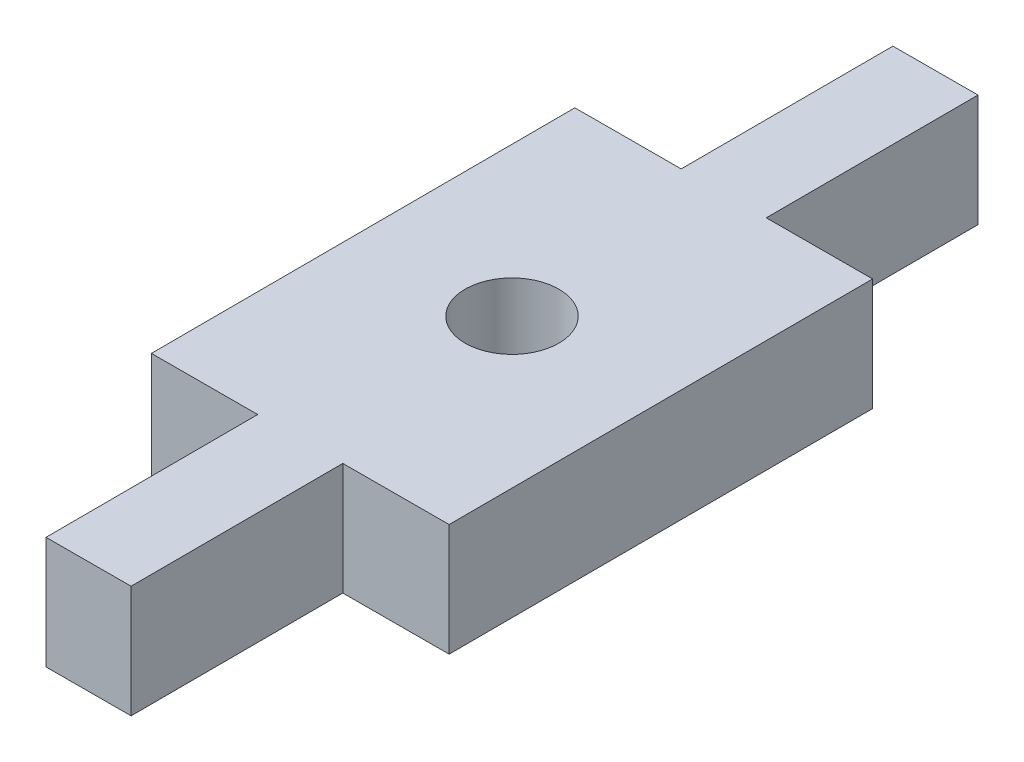
ISO-10303-21;
HEADER;
FILE_DESCRIPTION(('STEP AP214'),'2;1');
FILE_NAME('part.step','',(''),(''),'','','');
FILE_SCHEMA(('AUTOMOTIVE_DESIGN { 1 0 10303 214 1 1 1 1 }'));
ENDSEC;
DATA;
#1=APPLICATION_CONTEXT('core data for automotive mechanical design processes');
#2=APPLICATION_PROTOCOL_DEFINITION('international standard','automotive_design',2000,#1);
#3=PRODUCT_CONTEXT('',#1,'mechanical');
#4=PRODUCT('Part','Part','',(#3));
#5=PRODUCT_RELATED_PRODUCT_CATEGORY('part','',(#4));
#6=PRODUCT_DEFINITION_FORMATION('','',#4);
#7=PRODUCT_DEFINITION_CONTEXT('part definition',#1,'design');
#8=PRODUCT_DEFINITION('design','',#6,#7);
#9=PRODUCT_DEFINITION_SHAPE('','',#8);
#10=(LENGTH_UNIT() NAMED_UNIT(*) SI_UNIT(.MILLI.,.METRE.));
#11=(NAMED_UNIT(*) PLANE_ANGLE_UNIT() SI_UNIT($,.RADIAN.));
#12=(NAMED_UNIT(*) SI_UNIT($,.STERADIAN.) SOLID_ANGLE_UNIT());
#13=UNCERTAINTY_MEASURE_WITH_UNIT(LENGTH_MEASURE(1.E-05),#10,'distance_accuracy_value','');
#14=(GEOMETRIC_REPRESENTATION_CONTEXT(3) GLOBAL_UNCERTAINTY_ASSIGNED_CONTEXT((#13)) GLOBAL_UNIT_ASSIGNED_CONTEXT((#10,
#11,#12)) REPRESENTATION_CONTEXT('',''));
#15=CARTESIAN_POINT('',(0.,0.,0.));
#16=DIRECTION('',(0.,0.,1.));
#17=DIRECTION('',(1.,0.,0.));
#18=AXIS2_PLACEMENT_3D('',#15,#16,#17);
#19=CARTESIAN_POINT('',(0.,3.175,0.));
#20=DIRECTION('',(0.,1.,0.));
#21=DIRECTION('',(0.,0.,1.));
#22=AXIS2_PLACEMENT_3D('',#19,#20,#21);
#23=PLANE('',#22);
#24=DIRECTION('',(0.999997580008784,0.,-0.00219999467602244));
#25=VECTOR('',#24,1.);
#26=CARTESIAN_POINT('',(92.4276741866698,3.175,-114.600216956215));
#27=LINE('',#26,#25);
#28=CARTESIAN_POINT('',(92.4276741866698,3.175,-114.600216956215));
#29=VERTEX_POINT('',#28);
#30=CARTESIAN_POINT('',(95.4276741866698,3.175,-114.606816956215));
#31=VERTEX_POINT('',#30);
#32=EDGE_CURVE('E179',#29,#31,#27,.T.);
#33=ORIENTED_EDGE('',*,*,#32,.T.);
#34=DIRECTION('',(0.00228106838266912,0.,0.999997398360132));
#35=VECTOR('',#34,1.);
#36=CARTESIAN_POINT('',(95.4276741866698,3.175,-114.606816956215));
#37=LINE('',#36,#35);
#38=CARTESIAN_POINT('',(95.4413604477624,3.175,-108.606897975344));
#39=VERTEX_POINT('',#38);
#40=EDGE_CURVE('E107',#31,#39,#37,.T.);
#41=ORIENTED_EDGE('',*,*,#40,.T.);
#42=DIRECTION('',(0.999997468759611,0.,-0.002249994304716));
#43=VECTOR('',#42,1.);
#44=CARTESIAN_POINT('',(95.4413604477624,3.175,-108.606897975344));
#45=LINE('',#44,#43);
#46=CARTESIAN_POINT('',(97.8413604477624,3.175,-108.612297975344));
#47=VERTEX_POINT('',#46);
#48=EDGE_CURVE('E206',#39,#47,#45,.T.);
#49=ORIENTED_EDGE('',*,*,#48,.T.);
#50=DIRECTION('',(-0.00226666084387663,0.,-0.99999743112101));
#51=VECTOR('',#50,1.);
#52=CARTESIAN_POINT('',(97.8413604477624,3.175,-108.612297975344));
#53=LINE('',#52,#51);
#54=CARTESIAN_POINT('',(97.8277606867294,3.175,-114.612192548722));
#55=VERTEX_POINT('',#54);
#56=EDGE_CURVE('E225',#47,#55,#53,.T.);
#57=ORIENTED_EDGE('',*,*,#56,.T.);
#58=DIRECTION('',(0.999997412326608,0.,-0.00227493738100782));
#59=VECTOR('',#58,1.);
#60=CARTESIAN_POINT('',(97.8277606867294,3.175,-114.612192548722));
#61=LINE('',#60,#59);
#62=CARTESIAN_POINT('',(100.827653148747,3.175,-114.619017133883));
#63=VERTEX_POINT('',#62);
#64=EDGE_CURVE('E222',#55,#63,#61,.T.);
#65=ORIENTED_EDGE('',*,*,#64,.T.);
#66=DIRECTION('',(-0.00225003180504995,0.,-0.999997468675234));
#67=VECTOR('',#66,1.);
#68=CARTESIAN_POINT('',(100.827653148747,3.175,-114.619017133883));
#69=LINE('',#68,#67);
#70=CARTESIAN_POINT('',(100.800652767078,3.175,-126.618986761707));
#71=VERTEX_POINT('',#70);
#72=EDGE_CURVE('E224',#63,#71,#69,.T.);
#73=ORIENTED_EDGE('',*,*,#72,.T.);
#74=DIRECTION('',(-0.999997412326608,0.,0.00227493738100863));
#75=VECTOR('',#74,1.);
#76=CARTESIAN_POINT('',(100.800652767078,3.175,-126.618986761707));
#77=LINE('',#76,#75);
#78=CARTESIAN_POINT('',(97.8007607520716,3.175,-126.612162177564));
#79=VERTEX_POINT('',#78);
#80=EDGE_CURVE('E227',#71,#79,#77,.T.);
#81=ORIENTED_EDGE('',*,*,#80,.T.);
#82=DIRECTION('',(-0.00223332776366746,0.,-0.99999750612044));
#83=VECTOR('',#82,1.);
#84=CARTESIAN_POINT('',(97.8007607520716,3.175,-126.612162177564));
#85=LINE('',#84,#83);
#86=CARTESIAN_POINT('',(97.7873605844644,3.175,-132.612237225575));
#87=VERTEX_POINT('',#86);
#88=EDGE_CURVE('E233',#79,#87,#85,.T.);
#89=ORIENTED_EDGE('',*,*,#88,.T.);
#90=DIRECTION('',(-0.999997468759611,0.,0.002249994304716));
#91=VECTOR('',#90,1.);
#92=CARTESIAN_POINT('',(97.7873605844644,3.175,-132.612237225575));
#93=LINE('',#92,#91);
#94=CARTESIAN_POINT('',(95.3873605844644,3.175,-132.606837225575));
#95=VERTEX_POINT('',#94);
#96=EDGE_CURVE('E138',#87,#95,#93,.T.);
#97=ORIENTED_EDGE('',*,*,#96,.T.);
#98=DIRECTION('',(0.00223558704985642,0.,0.999997501072149));
#99=VECTOR('',#98,1.);
#100=CARTESIAN_POINT('',(95.3873605844644,3.175,-132.606837225575));
#101=LINE('',#100,#99);
#102=CARTESIAN_POINT('',(95.4007742529776,3.175,-126.606786816326));
#103=VERTEX_POINT('',#102);
#104=EDGE_CURVE('E132',#95,#103,#101,.T.);
#105=ORIENTED_EDGE('',*,*,#104,.T.);
#106=DIRECTION('',(-0.999997580008784,0.,0.00219999467602248));
#107=VECTOR('',#106,1.);
#108=CARTESIAN_POINT('',(95.4007742529776,3.175,-126.606786816326));
#109=LINE('',#108,#107);
#110=CARTESIAN_POINT('',(92.4006738049754,3.175,-126.60018659534));
#111=VERTEX_POINT('',#110);
#112=EDGE_CURVE('E136',#103,#111,#109,.T.);
#113=ORIENTED_EDGE('',*,*,#112,.T.);
#114=DIRECTION('',(0.00225003180504973,0.,0.999997468675234));
#115=VECTOR('',#114,1.);
#116=CARTESIAN_POINT('',(92.4006738049754,3.175,-126.60018659534));
#117=LINE('',#116,#115);
#118=EDGE_CURVE('E52',#111,#29,#117,.T.);
#119=ORIENTED_EDGE('',*,*,#118,.T.);
#120=EDGE_LOOP('',(#33,#41,#49,#57,#65,#73,#81,#89,#97,#105,#113,#119));
#121=FACE_BOUND('',#120,.T.);
#122=CARTESIAN_POINT('',(96.6141635549539,3.175,-120.609567157297));
#123=DIRECTION('',(0.,1.,0.));
#124=DIRECTION('',(0.,0.,1.));
#125=AXIS2_PLACEMENT_3D('',#122,#123,#124);
#126=CIRCLE('',#125,1.32487402891747);
#127=CARTESIAN_POINT('',(96.6141635549539,3.175,-119.28469312838));
#128=VERTEX_POINT('',#127);
#129=EDGE_CURVE('E160',#128,#128,#126,.T.);
#130=ORIENTED_EDGE('',*,*,#129,.F.);
#131=EDGE_LOOP('',(#130));
#132=FACE_BOUND('',#131,.T.);
#133=ADVANCED_FACE('F35',(#121,#132),#23,.T.);
#134=CARTESIAN_POINT('',(0.,0.,0.));
#135=DIRECTION('',(0.,1.,0.));
#136=DIRECTION('',(0.,0.,1.));
#137=AXIS2_PLACEMENT_3D('',#134,#135,#136);
#138=PLANE('',#137);
#139=DIRECTION('',(0.999997580008784,0.,-0.00219999467602244));
#140=VECTOR('',#139,1.);
#141=CARTESIAN_POINT('',(92.4276741866698,0.,-114.600216956215));
#142=LINE('',#141,#140);
#143=CARTESIAN_POINT('',(92.4276741866698,0.,-114.600216956215));
#144=VERTEX_POINT('',#143);
#145=CARTESIAN_POINT('',(95.4276741866698,0.,-114.606816956215));
#146=VERTEX_POINT('',#145);
#147=EDGE_CURVE('E156',#144,#146,#142,.T.);
#148=ORIENTED_EDGE('',*,*,#147,.F.);
#149=DIRECTION('',(0.00225003180504973,0.,0.999997468675234));
#150=VECTOR('',#149,1.);
#151=CARTESIAN_POINT('',(92.4006738049754,0.,-126.60018659534));
#152=LINE('',#151,#150);
#153=CARTESIAN_POINT('',(92.4006738049754,0.,-126.60018659534));
#154=VERTEX_POINT('',#153);
#155=EDGE_CURVE('E99',#154,#144,#152,.T.);
#156=ORIENTED_EDGE('',*,*,#155,.F.);
#157=DIRECTION('',(-0.999997580008784,0.,0.00219999467602248));
#158=VECTOR('',#157,1.);
#159=CARTESIAN_POINT('',(95.4007742529776,0.,-126.606786816326));
#160=LINE('',#159,#158);
#161=CARTESIAN_POINT('',(95.4007742529776,0.,-126.606786816326));
#162=VERTEX_POINT('',#161);
#163=EDGE_CURVE('E93',#162,#154,#160,.T.);
#164=ORIENTED_EDGE('',*,*,#163,.F.);
#165=DIRECTION('',(0.00223558704985642,0.,0.999997501072149));
#166=VECTOR('',#165,1.);
#167=CARTESIAN_POINT('',(95.3873605844644,0.,-132.606837225575));
#168=LINE('',#167,#166);
#169=CARTESIAN_POINT('',(95.3873605844644,0.,-132.606837225575));
#170=VERTEX_POINT('',#169);
#171=EDGE_CURVE('E146',#170,#162,#168,.T.);
#172=ORIENTED_EDGE('',*,*,#171,.F.);
#173=DIRECTION('',(-0.999997468759611,0.,0.002249994304716));
#174=VECTOR('',#173,1.);
#175=CARTESIAN_POINT('',(97.7873605844644,0.,-132.612237225575));
#176=LINE('',#175,#174);
#177=CARTESIAN_POINT('',(97.7873605844644,0.,-132.612237225575));
#178=VERTEX_POINT('',#177);
#179=EDGE_CURVE('E174',#178,#170,#176,.T.);
#180=ORIENTED_EDGE('',*,*,#179,.F.);
#181=DIRECTION('',(-0.00223332776366746,0.,-0.99999750612044));
#182=VECTOR('',#181,1.);
#183=CARTESIAN_POINT('',(97.8007607520716,0.,-126.612162177564));
#184=LINE('',#183,#182);
#185=CARTESIAN_POINT('',(97.8007607520716,0.,-126.612162177564));
#186=VERTEX_POINT('',#185);
#187=EDGE_CURVE('E172',#186,#178,#184,.T.);
#188=ORIENTED_EDGE('',*,*,#187,.F.);
#189=DIRECTION('',(-0.999997412326608,0.,0.00227493738100863));
#190=VECTOR('',#189,1.);
#191=CARTESIAN_POINT('',(100.800652767078,0.,-126.618986761707));
#192=LINE('',#191,#190);
#193=CARTESIAN_POINT('',(100.800652767078,0.,-126.618986761707));
#194=VERTEX_POINT('',#193);
#195=EDGE_CURVE('E170',#194,#186,#192,.T.);
#196=ORIENTED_EDGE('',*,*,#195,.F.);
#197=DIRECTION('',(-0.00225003180504995,0.,-0.999997468675234));
#198=VECTOR('',#197,1.);
#199=CARTESIAN_POINT('',(100.827653148747,0.,-114.619017133883));
#200=LINE('',#199,#198);
#201=CARTESIAN_POINT('',(100.827653148747,0.,-114.619017133883));
#202=VERTEX_POINT('',#201);
#203=EDGE_CURVE('E168',#202,#194,#200,.T.);
#204=ORIENTED_EDGE('',*,*,#203,.F.);
#205=DIRECTION('',(0.999997412326608,0.,-0.00227493738100782));
#206=VECTOR('',#205,1.);
#207=CARTESIAN_POINT('',(97.8277606867294,0.,-114.612192548722));
#208=LINE('',#207,#206);
#209=CARTESIAN_POINT('',(97.8277606867294,0.,-114.612192548722));
#210=VERTEX_POINT('',#209);
#211=EDGE_CURVE('E166',#210,#202,#208,.T.);
#212=ORIENTED_EDGE('',*,*,#211,.F.);
#213=DIRECTION('',(-0.00226666084387663,0.,-0.99999743112101));
#214=VECTOR('',#213,1.);
#215=CARTESIAN_POINT('',(97.8413604477624,0.,-108.612297975344));
#216=LINE('',#215,#214);
#217=CARTESIAN_POINT('',(97.8413604477624,0.,-108.612297975344));
#218=VERTEX_POINT('',#217);
#219=EDGE_CURVE('E164',#218,#210,#216,.T.);
#220=ORIENTED_EDGE('',*,*,#219,.F.);
#221=DIRECTION('',(0.999997468759611,0.,-0.002249994304716));
#222=VECTOR('',#221,1.);
#223=CARTESIAN_POINT('',(95.4413604477624,0.,-108.606897975344));
#224=LINE('',#223,#222);
#225=CARTESIAN_POINT('',(95.4413604477624,0.,-108.606897975344));
#226=VERTEX_POINT('',#225);
#227=EDGE_CURVE('E162',#226,#218,#224,.T.);
#228=ORIENTED_EDGE('',*,*,#227,.F.);
#229=DIRECTION('',(0.00228106838266912,0.,0.999997398360132));
#230=VECTOR('',#229,1.);
#231=CARTESIAN_POINT('',(95.4276741866698,0.,-114.606816956215));
#232=LINE('',#231,#230);
#233=EDGE_CURVE('E159',#146,#226,#232,.T.);
#234=ORIENTED_EDGE('',*,*,#233,.F.);
#235=EDGE_LOOP('',(#148,#156,#164,#172,#180,#188,#196,#204,#212,#220,#228,#234));
#236=FACE_BOUND('',#235,.T.);
#237=CARTESIAN_POINT('',(96.6141635549539,0.,-120.609567157297));
#238=DIRECTION('',(0.,1.,0.));
#239=DIRECTION('',(0.,0.,1.));
#240=AXIS2_PLACEMENT_3D('',#237,#238,#239);
#241=CIRCLE('',#240,1.32487402891747);
#242=CARTESIAN_POINT('',(96.6141635549539,0.,-119.28469312838));
#243=VERTEX_POINT('',#242);
#244=EDGE_CURVE('E380',#243,#243,#241,.T.);
#245=ORIENTED_EDGE('',*,*,#244,.T.);
#246=EDGE_LOOP('',(#245));
#247=FACE_BOUND('',#246,.T.);
#248=ADVANCED_FACE('F210',(#236,#247),#138,.F.);
#249=CARTESIAN_POINT('',(92.4276741866698,3.175,-114.600216956215));
#250=DIRECTION('',(-0.00219999467602244,0.,-0.999997580008785));
#251=DIRECTION('',(-0.999997580008785,0.,0.00219999467602244));
#252=AXIS2_PLACEMENT_3D('',#249,#250,#251);
#253=PLANE('',#252);
#254=ORIENTED_EDGE('',*,*,#147,.T.);
#255=DIRECTION('',(0.,-1.,0.));
#256=VECTOR('',#255,1.);
#257=CARTESIAN_POINT('',(95.4276741866698,3.175,-114.606816956215));
#258=LINE('',#257,#256);
#259=EDGE_CURVE('E11',#31,#146,#258,.T.);
#260=ORIENTED_EDGE('',*,*,#259,.F.);
#261=ORIENTED_EDGE('',*,*,#32,.F.);
#262=DIRECTION('',(0.,-1.,0.));
#263=VECTOR('',#262,1.);
#264=CARTESIAN_POINT('',(92.4276741866698,3.175,-114.600216956215));
#265=LINE('',#264,#263);
#266=EDGE_CURVE('E152',#29,#144,#265,.T.);
#267=ORIENTED_EDGE('',*,*,#266,.T.);
#268=EDGE_LOOP('',(#254,#260,#261,#267));
#269=FACE_BOUND('',#268,.T.);
#270=ADVANCED_FACE('F37',(#269),#253,.F.);
#271=CARTESIAN_POINT('',(95.4276741866698,3.175,-114.606816956215));
#272=DIRECTION('',(0.999997398360132,0.,-0.00228106838266912));
#273=DIRECTION('',(-0.00228106838266912,0.,-0.999997398360133));
#274=AXIS2_PLACEMENT_3D('',#271,#272,#273);
#275=PLANE('',#274);
#276=ORIENTED_EDGE('',*,*,#233,.T.);
#277=DIRECTION('',(0.,-1.,0.));
#278=VECTOR('',#277,1.);
#279=CARTESIAN_POINT('',(95.4413604477624,3.175,-108.606897975344));
#280=LINE('',#279,#278);
#281=EDGE_CURVE('E44',#39,#226,#280,.T.);
#282=ORIENTED_EDGE('',*,*,#281,.F.);
#283=ORIENTED_EDGE('',*,*,#40,.F.);
#284=ORIENTED_EDGE('',*,*,#259,.T.);
#285=EDGE_LOOP('',(#276,#282,#283,#284));
#286=FACE_BOUND('',#285,.T.);
#287=ADVANCED_FACE('F267',(#286),#275,.F.);
#288=CARTESIAN_POINT('',(95.4413604477624,3.175,-108.606897975344));
#289=DIRECTION('',(-0.002249994304716,0.,-0.999997468759611));
#290=DIRECTION('',(-0.999997468759611,0.,0.002249994304716));
#291=AXIS2_PLACEMENT_3D('',#288,#289,#290);
#292=PLANE('',#291);
#293=ORIENTED_EDGE('',*,*,#227,.T.);
#294=DIRECTION('',(0.,-1.,0.));
#295=VECTOR('',#294,1.);
#296=CARTESIAN_POINT('',(97.8413604477624,3.175,-108.612297975344));
#297=LINE('',#296,#295);
#298=EDGE_CURVE('E198',#47,#218,#297,.T.);
#299=ORIENTED_EDGE('',*,*,#298,.F.);
#300=ORIENTED_EDGE('',*,*,#48,.F.);
#301=ORIENTED_EDGE('',*,*,#281,.T.);
#302=EDGE_LOOP('',(#293,#299,#300,#301));
#303=FACE_BOUND('',#302,.T.);
#304=ADVANCED_FACE('F204',(#303),#292,.F.);
#305=CARTESIAN_POINT('',(97.8413604477624,3.175,-108.612297975344));
#306=DIRECTION('',(-0.99999743112101,0.,0.00226666084387663));
#307=DIRECTION('',(0.00226666084387663,0.,0.99999743112101));
#308=AXIS2_PLACEMENT_3D('',#305,#306,#307);
#309=PLANE('',#308);
#310=ORIENTED_EDGE('',*,*,#219,.T.);
#311=DIRECTION('',(0.,-1.,0.));
#312=VECTOR('',#311,1.);
#313=CARTESIAN_POINT('',(97.8277606867294,3.175,-114.612192548722));
#314=LINE('',#313,#312);
#315=EDGE_CURVE('E195',#55,#210,#314,.T.);
#316=ORIENTED_EDGE('',*,*,#315,.F.);
#317=ORIENTED_EDGE('',*,*,#56,.F.);
#318=ORIENTED_EDGE('',*,*,#298,.T.);
#319=EDGE_LOOP('',(#310,#316,#317,#318));
#320=FACE_BOUND('',#319,.T.);
#321=ADVANCED_FACE('F216',(#320),#309,.F.);
#322=CARTESIAN_POINT('',(97.8277606867294,3.175,-114.612192548722));
#323=DIRECTION('',(-0.00227493738100782,0.,-0.999997412326608));
#324=DIRECTION('',(-0.999997412326608,0.,0.00227493738100782));
#325=AXIS2_PLACEMENT_3D('',#322,#323,#324);
#326=PLANE('',#325);
#327=ORIENTED_EDGE('',*,*,#211,.T.);
#328=DIRECTION('',(0.,-1.,0.));
#329=VECTOR('',#328,1.);
#330=CARTESIAN_POINT('',(100.827653148747,3.175,-114.619017133883));
#331=LINE('',#330,#329);
#332=EDGE_CURVE('E192',#63,#202,#331,.T.);
#333=ORIENTED_EDGE('',*,*,#332,.F.);
#334=ORIENTED_EDGE('',*,*,#64,.F.);
#335=ORIENTED_EDGE('',*,*,#315,.T.);
#336=EDGE_LOOP('',(#327,#333,#334,#335));
#337=FACE_BOUND('',#336,.T.);
#338=ADVANCED_FACE('F220',(#337),#326,.F.);
#339=CARTESIAN_POINT('',(100.827653148747,3.175,-114.619017133883));
#340=DIRECTION('',(-0.999997468675234,0.,0.00225003180504995));
#341=DIRECTION('',(0.00225003180504995,0.,0.999997468675234));
#342=AXIS2_PLACEMENT_3D('',#339,#340,#341);
#343=PLANE('',#342);
#344=ORIENTED_EDGE('',*,*,#203,.T.);
#345=DIRECTION('',(0.,-1.,0.));
#346=VECTOR('',#345,1.);
#347=CARTESIAN_POINT('',(100.800652767078,3.175,-126.618986761707));
#348=LINE('',#347,#346);
#349=EDGE_CURVE('E189',#71,#194,#348,.T.);
#350=ORIENTED_EDGE('',*,*,#349,.F.);
#351=ORIENTED_EDGE('',*,*,#72,.F.);
#352=ORIENTED_EDGE('',*,*,#332,.T.);
#353=EDGE_LOOP('',(#344,#350,#351,#352));
#354=FACE_BOUND('',#353,.T.);
#355=ADVANCED_FACE('F280',(#354),#343,.F.);
#356=CARTESIAN_POINT('',(100.800652767078,3.175,-126.618986761707));
#357=DIRECTION('',(0.00227493738100863,0.,0.999997412326608));
#358=DIRECTION('',(0.999997412326608,0.,-0.00227493738100863));
#359=AXIS2_PLACEMENT_3D('',#356,#357,#358);
#360=PLANE('',#359);
#361=ORIENTED_EDGE('',*,*,#195,.T.);
#362=DIRECTION('',(0.,-1.,0.));
#363=VECTOR('',#362,1.);
#364=CARTESIAN_POINT('',(97.8007607520716,3.175,-126.612162177564));
#365=LINE('',#364,#363);
#366=EDGE_CURVE('E186',#79,#186,#365,.T.);
#367=ORIENTED_EDGE('',*,*,#366,.F.);
#368=ORIENTED_EDGE('',*,*,#80,.F.);
#369=ORIENTED_EDGE('',*,*,#349,.T.);
#370=EDGE_LOOP('',(#361,#367,#368,#369));
#371=FACE_BOUND('',#370,.T.);
#372=ADVANCED_FACE('F283',(#371),#360,.F.);
#373=CARTESIAN_POINT('',(97.8007607520716,3.175,-126.612162177564));
#374=DIRECTION('',(-0.99999750612044,0.,0.00223332776366746));
#375=DIRECTION('',(0.00223332776366746,0.,0.99999750612044));
#376=AXIS2_PLACEMENT_3D('',#373,#374,#375);
#377=PLANE('',#376);
#378=ORIENTED_EDGE('',*,*,#187,.T.);
#379=DIRECTION('',(0.,-1.,0.));
#380=VECTOR('',#379,1.);
#381=CARTESIAN_POINT('',(97.7873605844644,3.175,-132.612237225575));
#382=LINE('',#381,#380);
#383=EDGE_CURVE('E183',#87,#178,#382,.T.);
#384=ORIENTED_EDGE('',*,*,#383,.F.);
#385=ORIENTED_EDGE('',*,*,#88,.F.);
#386=ORIENTED_EDGE('',*,*,#366,.T.);
#387=EDGE_LOOP('',(#378,#384,#385,#386));
#388=FACE_BOUND('',#387,.T.);
#389=ADVANCED_FACE('F239',(#388),#377,.F.);
#390=CARTESIAN_POINT('',(97.7873605844644,3.175,-132.612237225575));
#391=DIRECTION('',(0.002249994304716,0.,0.999997468759611));
#392=DIRECTION('',(0.999997468759611,0.,-0.002249994304716));
#393=AXIS2_PLACEMENT_3D('',#390,#391,#392);
#394=PLANE('',#393);
#395=ORIENTED_EDGE('',*,*,#179,.T.);
#396=DIRECTION('',(0.,-1.,0.));
#397=VECTOR('',#396,1.);
#398=CARTESIAN_POINT('',(95.3873605844644,3.175,-132.606837225575));
#399=LINE('',#398,#397);
#400=EDGE_CURVE('E147',#95,#170,#399,.T.);
#401=ORIENTED_EDGE('',*,*,#400,.F.);
#402=ORIENTED_EDGE('',*,*,#96,.F.);
#403=ORIENTED_EDGE('',*,*,#383,.T.);
#404=EDGE_LOOP('',(#395,#401,#402,#403));
#405=FACE_BOUND('',#404,.T.);
#406=ADVANCED_FACE('F243',(#405),#394,.F.);
#407=CARTESIAN_POINT('',(95.3873605844644,3.175,-132.606837225575));
#408=DIRECTION('',(0.999997501072149,0.,-0.00223558704985642));
#409=DIRECTION('',(-0.00223558704985642,0.,-0.999997501072149));
#410=AXIS2_PLACEMENT_3D('',#407,#408,#409);
#411=PLANE('',#410);
#412=ORIENTED_EDGE('',*,*,#171,.T.);
#413=DIRECTION('',(0.,-1.,0.));
#414=VECTOR('',#413,1.);
#415=CARTESIAN_POINT('',(95.4007742529776,3.175,-126.606786816326));
#416=LINE('',#415,#414);
#417=EDGE_CURVE('E143',#103,#162,#416,.T.);
#418=ORIENTED_EDGE('',*,*,#417,.F.);
#419=ORIENTED_EDGE('',*,*,#104,.F.);
#420=ORIENTED_EDGE('',*,*,#400,.T.);
#421=EDGE_LOOP('',(#412,#418,#419,#420));
#422=FACE_BOUND('',#421,.T.);
#423=ADVANCED_FACE('F144',(#422),#411,.F.);
#424=CARTESIAN_POINT('',(95.4007742529776,3.175,-126.606786816326));
#425=DIRECTION('',(0.00219999467602248,0.,0.999997580008785));
#426=DIRECTION('',(0.999997580008785,0.,-0.00219999467602248));
#427=AXIS2_PLACEMENT_3D('',#424,#425,#426);
#428=PLANE('',#427);
#429=ORIENTED_EDGE('',*,*,#163,.T.);
#430=DIRECTION('',(0.,-1.,0.));
#431=VECTOR('',#430,1.);
#432=CARTESIAN_POINT('',(92.4006738049754,3.175,-126.60018659534));
#433=LINE('',#432,#431);
#434=EDGE_CURVE('E148',#111,#154,#433,.T.);
#435=ORIENTED_EDGE('',*,*,#434,.F.);
#436=ORIENTED_EDGE('',*,*,#112,.F.);
#437=ORIENTED_EDGE('',*,*,#417,.T.);
#438=EDGE_LOOP('',(#429,#435,#436,#437));
#439=FACE_BOUND('',#438,.T.);
#440=ADVANCED_FACE('F150',(#439),#428,.F.);
#441=CARTESIAN_POINT('',(92.4006738049754,3.175,-126.60018659534));
#442=DIRECTION('',(0.999997468675234,0.,-0.00225003180504973));
#443=DIRECTION('',(-0.00225003180504973,0.,-0.999997468675234));
#444=AXIS2_PLACEMENT_3D('',#441,#442,#443);
#445=PLANE('',#444);
#446=ORIENTED_EDGE('',*,*,#155,.T.);
#447=ORIENTED_EDGE('',*,*,#266,.F.);
#448=ORIENTED_EDGE('',*,*,#118,.F.);
#449=ORIENTED_EDGE('',*,*,#434,.T.);
#450=EDGE_LOOP('',(#446,#447,#448,#449));
#451=FACE_BOUND('',#450,.T.);
#452=ADVANCED_FACE('F247',(#451),#445,.F.);
#453=CARTESIAN_POINT('',(96.6141635549539,3.175,-120.609567157297));
#454=DIRECTION('',(0.,-1.,0.));
#455=DIRECTION('',(0.,0.,-1.));
#456=AXIS2_PLACEMENT_3D('',#453,#454,#455);
#457=CYLINDRICAL_SURFACE('',#456,1.32487402891747);
#458=ORIENTED_EDGE('',*,*,#129,.T.);
#459=EDGE_LOOP('',(#458));
#460=FACE_BOUND('',#459,.T.);
#461=ORIENTED_EDGE('',*,*,#244,.F.);
#462=EDGE_LOOP('',(#461));
#463=FACE_BOUND('',#462,.T.);
#464=ADVANCED_FACE('F249',(#460,#463),#457,.F.);
#465=CLOSED_SHELL('',(#133,#248,#270,#287,#304,#321,#338,#355,#372,#389,#406,#423,#440,#452,#464));
#466=MANIFOLD_SOLID_BREP('B2',#465);
#467=ADVANCED_BREP_SHAPE_REPRESENTATION('',(#18,#466),#14);
#468=SHAPE_DEFINITION_REPRESENTATION(#9,#467);
ENDSEC;
END-ISO-10303-21;
